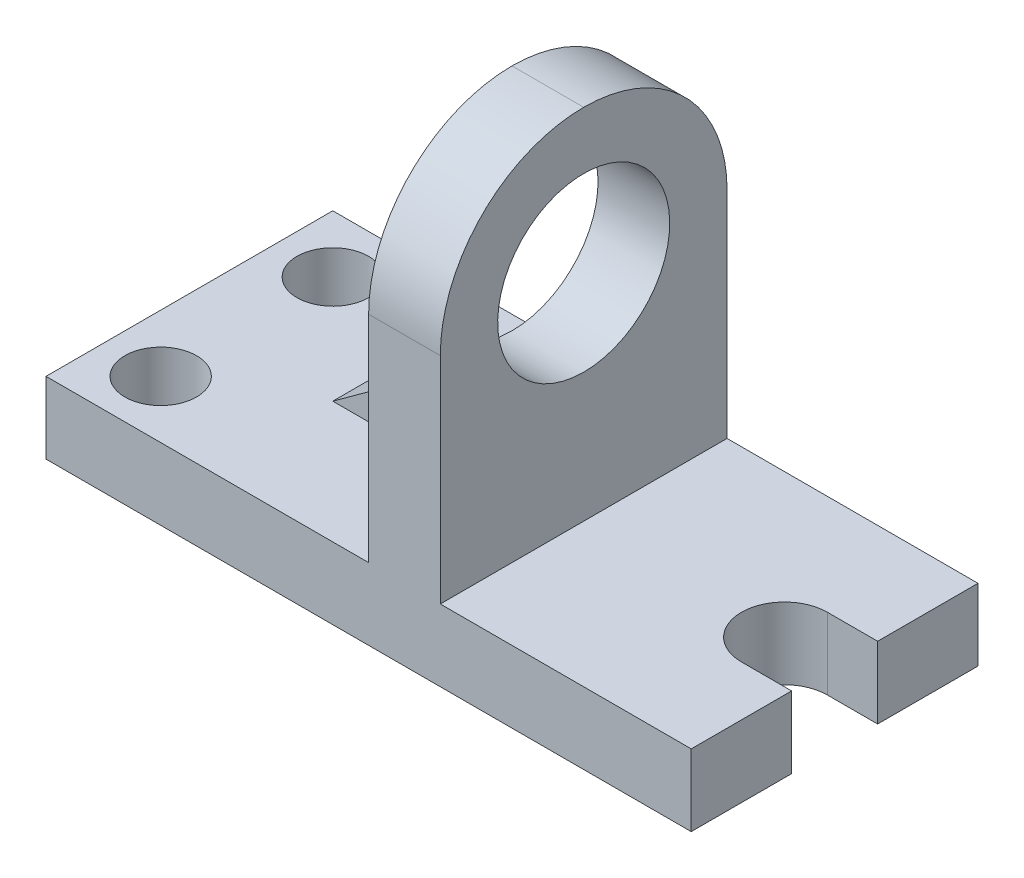
ISO-10303-21;
HEADER;
FILE_DESCRIPTION(('STEP AP214'),'2;1');
FILE_NAME('part.step','',(''),(''),'','','');
FILE_SCHEMA(('AUTOMOTIVE_DESIGN { 1 0 10303 214 1 1 1 1 }'));
ENDSEC;
DATA;
#1=APPLICATION_CONTEXT('core data for automotive mechanical design processes');
#2=APPLICATION_PROTOCOL_DEFINITION('international standard','automotive_design',2000,#1);
#3=PRODUCT_CONTEXT('',#1,'mechanical');
#4=PRODUCT('Part','Part','',(#3));
#5=PRODUCT_RELATED_PRODUCT_CATEGORY('part','',(#4));
#6=PRODUCT_DEFINITION_FORMATION('','',#4);
#7=PRODUCT_DEFINITION_CONTEXT('part definition',#1,'design');
#8=PRODUCT_DEFINITION('design','',#6,#7);
#9=PRODUCT_DEFINITION_SHAPE('','',#8);
#10=(LENGTH_UNIT() NAMED_UNIT(*) SI_UNIT(.MILLI.,.METRE.));
#11=(NAMED_UNIT(*) PLANE_ANGLE_UNIT() SI_UNIT($,.RADIAN.));
#12=(NAMED_UNIT(*) SI_UNIT($,.STERADIAN.) SOLID_ANGLE_UNIT());
#13=UNCERTAINTY_MEASURE_WITH_UNIT(LENGTH_MEASURE(1.E-05),#10,'distance_accuracy_value','');
#14=(GEOMETRIC_REPRESENTATION_CONTEXT(3) GLOBAL_UNCERTAINTY_ASSIGNED_CONTEXT((#13)) GLOBAL_UNIT_ASSIGNED_CONTEXT((#10,
#11,#12)) REPRESENTATION_CONTEXT('',''));
#15=CARTESIAN_POINT('',(0.,0.,0.));
#16=DIRECTION('',(0.,0.,1.));
#17=DIRECTION('',(1.,0.,0.));
#18=AXIS2_PLACEMENT_3D('',#15,#16,#17);
#19=CARTESIAN_POINT('',(0.,-2.5,-10.));
#20=DIRECTION('',(0.,-1.,0.));
#21=DIRECTION('',(0.,0.,-1.));
#22=AXIS2_PLACEMENT_3D('',#19,#20,#21);
#23=PLANE('',#22);
#24=DIRECTION('',(0.,0.,1.));
#25=VECTOR('',#24,1.);
#26=CARTESIAN_POINT('',(20.,-2.5,-10.));
#27=LINE('',#26,#25);
#28=CARTESIAN_POINT('',(20.,-2.5,-10.));
#29=VERTEX_POINT('',#28);
#30=CARTESIAN_POINT('',(20.,-2.5,-3.));
#31=VERTEX_POINT('',#30);
#32=EDGE_CURVE('E265',#29,#31,#27,.T.);
#33=ORIENTED_EDGE('',*,*,#32,.T.);
#34=DIRECTION('',(1.,0.,0.));
#35=VECTOR('',#34,1.);
#36=CARTESIAN_POINT('',(0.,-2.5,-3.));
#37=LINE('',#36,#35);
#38=CARTESIAN_POINT('',(16.5,-2.5,-3.));
#39=VERTEX_POINT('',#38);
#40=EDGE_CURVE('E188',#39,#31,#37,.T.);
#41=ORIENTED_EDGE('',*,*,#40,.F.);
#42=CARTESIAN_POINT('',(16.5,-2.5,0.));
#43=DIRECTION('',(0.,1.,0.));
#44=DIRECTION('',(0.,0.,1.));
#45=AXIS2_PLACEMENT_3D('',#42,#43,#44);
#46=CIRCLE('',#45,3.);
#47=CARTESIAN_POINT('',(16.5,-2.5,3.));
#48=VERTEX_POINT('',#47);
#49=EDGE_CURVE('E190',#39,#48,#46,.T.);
#50=ORIENTED_EDGE('',*,*,#49,.T.);
#51=DIRECTION('',(-1.,0.,0.));
#52=VECTOR('',#51,1.);
#53=CARTESIAN_POINT('',(0.,-2.5,3.));
#54=LINE('',#53,#52);
#55=CARTESIAN_POINT('',(20.,-2.5,3.));
#56=VERTEX_POINT('',#55);
#57=EDGE_CURVE('E193',#56,#48,#54,.T.);
#58=ORIENTED_EDGE('',*,*,#57,.F.);
#59=CARTESIAN_POINT('',(20.,-2.5,10.));
#60=VERTEX_POINT('',#59);
#61=EDGE_CURVE('E267',#56,#60,#27,.T.);
#62=ORIENTED_EDGE('',*,*,#61,.T.);
#63=DIRECTION('',(1.,0.,0.));
#64=VECTOR('',#63,1.);
#65=CARTESIAN_POINT('',(0.,-2.5,10.));
#66=LINE('',#65,#64);
#67=CARTESIAN_POINT('',(-25.,-2.5,10.));
#68=VERTEX_POINT('',#67);
#69=EDGE_CURVE('E168',#68,#60,#66,.T.);
#70=ORIENTED_EDGE('',*,*,#69,.F.);
#71=DIRECTION('',(0.,0.,1.));
#72=VECTOR('',#71,1.);
#73=CARTESIAN_POINT('',(-25.,-2.5,-10.));
#74=LINE('',#73,#72);
#75=CARTESIAN_POINT('',(-25.,-2.5,-10.));
#76=VERTEX_POINT('',#75);
#77=EDGE_CURVE('E165',#76,#68,#74,.T.);
#78=ORIENTED_EDGE('',*,*,#77,.F.);
#79=DIRECTION('',(1.,0.,0.));
#80=VECTOR('',#79,1.);
#81=CARTESIAN_POINT('',(0.,-2.5,-10.));
#82=LINE('',#81,#80);
#83=EDGE_CURVE('E152',#76,#29,#82,.T.);
#84=ORIENTED_EDGE('',*,*,#83,.T.);
#85=EDGE_LOOP('',(#33,#41,#50,#58,#62,#70,#78,#84));
#86=FACE_BOUND('',#85,.T.);
#87=CARTESIAN_POINT('',(-21.,-2.5,6.));
#88=DIRECTION('',(0.,1.,0.));
#89=DIRECTION('',(0.,0.,1.));
#90=AXIS2_PLACEMENT_3D('',#87,#88,#89);
#91=CIRCLE('',#90,2.5);
#92=CARTESIAN_POINT('',(-21.,-2.5,8.5));
#93=VERTEX_POINT('',#92);
#94=EDGE_CURVE('E178',#93,#93,#91,.T.);
#95=ORIENTED_EDGE('',*,*,#94,.T.);
#96=EDGE_LOOP('',(#95));
#97=FACE_BOUND('',#96,.T.);
#98=CARTESIAN_POINT('',(-21.,-2.5,-6.));
#99=DIRECTION('',(0.,-1.,0.));
#100=DIRECTION('',(0.,0.,-1.));
#101=AXIS2_PLACEMENT_3D('',#98,#99,#100);
#102=CIRCLE('',#101,2.5);
#103=CARTESIAN_POINT('',(-21.,-2.5,-8.5));
#104=VERTEX_POINT('',#103);
#105=EDGE_CURVE('E395',#104,#104,#102,.T.);
#106=ORIENTED_EDGE('',*,*,#105,.F.);
#107=EDGE_LOOP('',(#106));
#108=FACE_BOUND('',#107,.T.);
#109=ADVANCED_FACE('F37',(#86,#97,#108),#23,.T.);
#110=CARTESIAN_POINT('',(0.,2.5,-10.));
#111=DIRECTION('',(0.,-1.,0.));
#112=DIRECTION('',(0.,0.,-1.));
#113=AXIS2_PLACEMENT_3D('',#110,#111,#112);
#114=PLANE('',#113);
#115=DIRECTION('',(1.,0.,0.));
#116=VECTOR('',#115,1.);
#117=CARTESIAN_POINT('',(0.,2.5,-1.5));
#118=LINE('',#117,#116);
#119=CARTESIAN_POINT('',(-13.5,2.5,-1.5));
#120=VERTEX_POINT('',#119);
#121=CARTESIAN_POINT('',(-2.5,2.5,-1.5));
#122=VERTEX_POINT('',#121);
#123=EDGE_CURVE('E227',#120,#122,#118,.T.);
#124=ORIENTED_EDGE('',*,*,#123,.T.);
#125=DIRECTION('',(0.,0.,1.));
#126=VECTOR('',#125,1.);
#127=CARTESIAN_POINT('',(-2.5,2.5,-10.));
#128=LINE('',#127,#126);
#129=CARTESIAN_POINT('',(-2.5,2.5,-10.));
#130=VERTEX_POINT('',#129);
#131=EDGE_CURVE('E253',#130,#122,#128,.T.);
#132=ORIENTED_EDGE('',*,*,#131,.F.);
#133=DIRECTION('',(1.,0.,0.));
#134=VECTOR('',#133,1.);
#135=CARTESIAN_POINT('',(0.,2.5,-10.));
#136=LINE('',#135,#134);
#137=CARTESIAN_POINT('',(-25.,2.5,-10.));
#138=VERTEX_POINT('',#137);
#139=EDGE_CURVE('E249',#138,#130,#136,.T.);
#140=ORIENTED_EDGE('',*,*,#139,.F.);
#141=DIRECTION('',(0.,0.,-1.));
#142=VECTOR('',#141,1.);
#143=CARTESIAN_POINT('',(-25.,2.5,10.));
#144=LINE('',#143,#142);
#145=CARTESIAN_POINT('',(-25.,2.5,10.));
#146=VERTEX_POINT('',#145);
#147=EDGE_CURVE('E177',#146,#138,#144,.T.);
#148=ORIENTED_EDGE('',*,*,#147,.F.);
#149=DIRECTION('',(1.,0.,0.));
#150=VECTOR('',#149,1.);
#151=CARTESIAN_POINT('',(0.,2.5,10.));
#152=LINE('',#151,#150);
#153=CARTESIAN_POINT('',(-2.5,2.5,10.));
#154=VERTEX_POINT('',#153);
#155=EDGE_CURVE('E162',#146,#154,#152,.T.);
#156=ORIENTED_EDGE('',*,*,#155,.T.);
#157=CARTESIAN_POINT('',(-2.5,2.5,1.5));
#158=VERTEX_POINT('',#157);
#159=EDGE_CURVE('E257',#158,#154,#128,.T.);
#160=ORIENTED_EDGE('',*,*,#159,.F.);
#161=DIRECTION('',(1.,0.,0.));
#162=VECTOR('',#161,1.);
#163=CARTESIAN_POINT('',(0.,2.5,1.5));
#164=LINE('',#163,#162);
#165=CARTESIAN_POINT('',(-13.5,2.5,1.5));
#166=VERTEX_POINT('',#165);
#167=EDGE_CURVE('E218',#166,#158,#164,.T.);
#168=ORIENTED_EDGE('',*,*,#167,.F.);
#169=DIRECTION('',(0.,0.,1.));
#170=VECTOR('',#169,1.);
#171=CARTESIAN_POINT('',(-13.5,2.5,-1.5));
#172=LINE('',#171,#170);
#173=EDGE_CURVE('E230',#120,#166,#172,.T.);
#174=ORIENTED_EDGE('',*,*,#173,.F.);
#175=EDGE_LOOP('',(#124,#132,#140,#148,#156,#160,#168,#174));
#176=FACE_BOUND('',#175,.T.);
#177=CARTESIAN_POINT('',(-21.,2.5,6.));
#178=DIRECTION('',(0.,1.,0.));
#179=DIRECTION('',(0.,0.,1.));
#180=AXIS2_PLACEMENT_3D('',#177,#178,#179);
#181=CIRCLE('',#180,2.5);
#182=CARTESIAN_POINT('',(-21.,2.5,8.5));
#183=VERTEX_POINT('',#182);
#184=EDGE_CURVE('E181',#183,#183,#181,.T.);
#185=ORIENTED_EDGE('',*,*,#184,.F.);
#186=EDGE_LOOP('',(#185));
#187=FACE_BOUND('',#186,.T.);
#188=CARTESIAN_POINT('',(-21.,2.5,-6.));
#189=DIRECTION('',(0.,-1.,0.));
#190=DIRECTION('',(0.,0.,-1.));
#191=AXIS2_PLACEMENT_3D('',#188,#189,#190);
#192=CIRCLE('',#191,2.5);
#193=CARTESIAN_POINT('',(-21.,2.5,-8.5));
#194=VERTEX_POINT('',#193);
#195=EDGE_CURVE('E398',#194,#194,#192,.T.);
#196=ORIENTED_EDGE('',*,*,#195,.T.);
#197=EDGE_LOOP('',(#196));
#198=FACE_BOUND('',#197,.T.);
#199=ADVANCED_FACE('F300',(#176,#187,#198),#114,.F.);
#200=DIRECTION('',(1.,0.,0.));
#201=VECTOR('',#200,1.);
#202=CARTESIAN_POINT('',(0.,2.5,-3.));
#203=LINE('',#202,#201);
#204=CARTESIAN_POINT('',(16.5,2.5,-3.));
#205=VERTEX_POINT('',#204);
#206=CARTESIAN_POINT('',(20.,2.5,-3.));
#207=VERTEX_POINT('',#206);
#208=EDGE_CURVE('E187',#205,#207,#203,.T.);
#209=ORIENTED_EDGE('',*,*,#208,.T.);
#210=DIRECTION('',(0.,0.,1.));
#211=VECTOR('',#210,1.);
#212=CARTESIAN_POINT('',(20.,2.5,-10.));
#213=LINE('',#212,#211);
#214=CARTESIAN_POINT('',(20.,2.5,-10.));
#215=VERTEX_POINT('',#214);
#216=EDGE_CURVE('E261',#215,#207,#213,.T.);
#217=ORIENTED_EDGE('',*,*,#216,.F.);
#218=CARTESIAN_POINT('',(2.5,2.5,-10.));
#219=VERTEX_POINT('',#218);
#220=EDGE_CURVE('E246',#219,#215,#136,.T.);
#221=ORIENTED_EDGE('',*,*,#220,.F.);
#222=DIRECTION('',(0.,0.,1.));
#223=VECTOR('',#222,1.);
#224=CARTESIAN_POINT('',(2.5,2.5,-10.));
#225=LINE('',#224,#223);
#226=CARTESIAN_POINT('',(2.5,2.5,10.));
#227=VERTEX_POINT('',#226);
#228=EDGE_CURVE('E258',#219,#227,#225,.T.);
#229=ORIENTED_EDGE('',*,*,#228,.T.);
#230=CARTESIAN_POINT('',(20.,2.5,10.));
#231=VERTEX_POINT('',#230);
#232=EDGE_CURVE('E238',#227,#231,#152,.T.);
#233=ORIENTED_EDGE('',*,*,#232,.T.);
#234=CARTESIAN_POINT('',(20.,2.5,3.));
#235=VERTEX_POINT('',#234);
#236=EDGE_CURVE('E264',#235,#231,#213,.T.);
#237=ORIENTED_EDGE('',*,*,#236,.F.);
#238=DIRECTION('',(-1.,0.,0.));
#239=VECTOR('',#238,1.);
#240=CARTESIAN_POINT('',(0.,2.5,3.));
#241=LINE('',#240,#239);
#242=CARTESIAN_POINT('',(16.5,2.5,3.));
#243=VERTEX_POINT('',#242);
#244=EDGE_CURVE('E54',#235,#243,#241,.T.);
#245=ORIENTED_EDGE('',*,*,#244,.T.);
#246=CARTESIAN_POINT('',(16.5,2.5,0.));
#247=DIRECTION('',(0.,1.,0.));
#248=DIRECTION('',(0.,0.,1.));
#249=AXIS2_PLACEMENT_3D('',#246,#247,#248);
#250=CIRCLE('',#249,3.);
#251=EDGE_CURVE('E198',#205,#243,#250,.T.);
#252=ORIENTED_EDGE('',*,*,#251,.F.);
#253=EDGE_LOOP('',(#209,#217,#221,#229,#233,#237,#245,#252));
#254=FACE_BOUND('',#253,.T.);
#255=ADVANCED_FACE('F305',(#254),#114,.F.);
#256=CARTESIAN_POINT('',(20.,0.,-10.));
#257=DIRECTION('',(1.,0.,0.));
#258=DIRECTION('',(0.,0.,-1.));
#259=AXIS2_PLACEMENT_3D('',#256,#257,#258);
#260=PLANE('',#259);
#261=ORIENTED_EDGE('',*,*,#216,.T.);
#262=DIRECTION('',(0.,1.,0.));
#263=VECTOR('',#262,1.);
#264=CARTESIAN_POINT('',(20.,-2.5,-3.));
#265=LINE('',#264,#263);
#266=EDGE_CURVE('E202',#31,#207,#265,.T.);
#267=ORIENTED_EDGE('',*,*,#266,.F.);
#268=ORIENTED_EDGE('',*,*,#32,.F.);
#269=DIRECTION('',(0.,1.,0.));
#270=VECTOR('',#269,1.);
#271=CARTESIAN_POINT('',(20.,0.,-10.));
#272=LINE('',#271,#270);
#273=EDGE_CURVE('E159',#29,#215,#272,.T.);
#274=ORIENTED_EDGE('',*,*,#273,.T.);
#275=EDGE_LOOP('',(#261,#267,#268,#274));
#276=FACE_BOUND('',#275,.T.);
#277=ADVANCED_FACE('F309',(#276),#260,.T.);
#278=ORIENTED_EDGE('',*,*,#61,.F.);
#279=DIRECTION('',(0.,1.,0.));
#280=VECTOR('',#279,1.);
#281=CARTESIAN_POINT('',(20.,-2.5,3.));
#282=LINE('',#281,#280);
#283=EDGE_CURVE('E205',#56,#235,#282,.T.);
#284=ORIENTED_EDGE('',*,*,#283,.T.);
#285=ORIENTED_EDGE('',*,*,#236,.T.);
#286=DIRECTION('',(0.,1.,0.));
#287=VECTOR('',#286,1.);
#288=CARTESIAN_POINT('',(20.,0.,10.));
#289=LINE('',#288,#287);
#290=EDGE_CURVE('E235',#60,#231,#289,.T.);
#291=ORIENTED_EDGE('',*,*,#290,.F.);
#292=EDGE_LOOP('',(#278,#284,#285,#291));
#293=FACE_BOUND('',#292,.T.);
#294=ADVANCED_FACE('F312',(#293),#260,.T.);
#295=CARTESIAN_POINT('',(-2.5,0.,-10.));
#296=DIRECTION('',(-1.,0.,0.));
#297=DIRECTION('',(0.,-1.,0.));
#298=AXIS2_PLACEMENT_3D('',#295,#296,#297);
#299=PLANE('',#298);
#300=CARTESIAN_POINT('',(-2.5,17.5,0.));
#301=DIRECTION('',(-1.,0.,0.));
#302=DIRECTION('',(0.,-1.,0.));
#303=AXIS2_PLACEMENT_3D('',#300,#301,#302);
#304=CIRCLE('',#303,6.);
#305=CARTESIAN_POINT('',(-2.5,11.5,0.));
#306=VERTEX_POINT('',#305);
#307=EDGE_CURVE('E204',#306,#306,#304,.T.);
#308=ORIENTED_EDGE('',*,*,#307,.F.);
#309=EDGE_LOOP('',(#308));
#310=FACE_BOUND('',#309,.T.);
#311=DIRECTION('',(0.,-1.,0.));
#312=VECTOR('',#311,1.);
#313=CARTESIAN_POINT('',(-2.5,0.,10.));
#314=LINE('',#313,#312);
#315=CARTESIAN_POINT('',(-2.5,17.5,10.));
#316=VERTEX_POINT('',#315);
#317=EDGE_CURVE('E243',#316,#154,#314,.T.);
#318=ORIENTED_EDGE('',*,*,#317,.F.);
#319=CARTESIAN_POINT('',(-2.5,17.5,0.));
#320=DIRECTION('',(-1.,0.,0.));
#321=DIRECTION('',(0.,-1.,0.));
#322=AXIS2_PLACEMENT_3D('',#319,#320,#321);
#323=CIRCLE('',#322,10.);
#324=CARTESIAN_POINT('',(-2.5,27.5,0.));
#325=VERTEX_POINT('',#324);
#326=EDGE_CURVE('E46',#316,#325,#323,.T.);
#327=ORIENTED_EDGE('',*,*,#326,.T.);
#328=CARTESIAN_POINT('',(-2.5,17.5,0.));
#329=DIRECTION('',(-1.,0.,0.));
#330=DIRECTION('',(0.,-1.,0.));
#331=AXIS2_PLACEMENT_3D('',#328,#329,#330);
#332=CIRCLE('',#331,10.);
#333=CARTESIAN_POINT('',(-2.5,17.5,-10.));
#334=VERTEX_POINT('',#333);
#335=EDGE_CURVE('E62',#325,#334,#332,.T.);
#336=ORIENTED_EDGE('',*,*,#335,.T.);
#337=DIRECTION('',(0.,-1.,0.));
#338=VECTOR('',#337,1.);
#339=CARTESIAN_POINT('',(-2.5,0.,-10.));
#340=LINE('',#339,#338);
#341=EDGE_CURVE('E251',#334,#130,#340,.T.);
#342=ORIENTED_EDGE('',*,*,#341,.T.);
#343=ORIENTED_EDGE('',*,*,#131,.T.);
#344=DIRECTION('',(0.,-1.,0.));
#345=VECTOR('',#344,1.);
#346=CARTESIAN_POINT('',(-2.5,0.,-1.5));
#347=LINE('',#346,#345);
#348=CARTESIAN_POINT('',(-2.5,10.5,-1.5));
#349=VERTEX_POINT('',#348);
#350=EDGE_CURVE('E221',#349,#122,#347,.T.);
#351=ORIENTED_EDGE('',*,*,#350,.F.);
#352=DIRECTION('',(0.,0.,1.));
#353=VECTOR('',#352,1.);
#354=CARTESIAN_POINT('',(-2.5,10.5,-1.5));
#355=LINE('',#354,#353);
#356=CARTESIAN_POINT('',(-2.5,10.5,1.5));
#357=VERTEX_POINT('',#356);
#358=EDGE_CURVE('E229',#349,#357,#355,.T.);
#359=ORIENTED_EDGE('',*,*,#358,.T.);
#360=DIRECTION('',(0.,-1.,0.));
#361=VECTOR('',#360,1.);
#362=CARTESIAN_POINT('',(-2.5,0.,1.5));
#363=LINE('',#362,#361);
#364=EDGE_CURVE('E212',#357,#158,#363,.T.);
#365=ORIENTED_EDGE('',*,*,#364,.T.);
#366=ORIENTED_EDGE('',*,*,#159,.T.);
#367=EDGE_LOOP('',(#318,#327,#336,#342,#343,#351,#359,#365,#366));
#368=FACE_BOUND('',#367,.T.);
#369=ADVANCED_FACE('F316',(#310,#368),#299,.T.);
#370=CARTESIAN_POINT('',(2.5,0.,-10.));
#371=DIRECTION('',(-1.,0.,0.));
#372=DIRECTION('',(0.,-1.,0.));
#373=AXIS2_PLACEMENT_3D('',#370,#371,#372);
#374=PLANE('',#373);
#375=CARTESIAN_POINT('',(2.5,17.5,0.));
#376=DIRECTION('',(-1.,0.,0.));
#377=DIRECTION('',(0.,-1.,0.));
#378=AXIS2_PLACEMENT_3D('',#375,#376,#377);
#379=CIRCLE('',#378,6.);
#380=CARTESIAN_POINT('',(2.5,11.5,0.));
#381=VERTEX_POINT('',#380);
#382=EDGE_CURVE('E41',#381,#381,#379,.T.);
#383=ORIENTED_EDGE('',*,*,#382,.T.);
#384=EDGE_LOOP('',(#383));
#385=FACE_BOUND('',#384,.T.);
#386=CARTESIAN_POINT('',(2.5,17.5,0.));
#387=DIRECTION('',(-1.,0.,0.));
#388=DIRECTION('',(0.,-1.,0.));
#389=AXIS2_PLACEMENT_3D('',#386,#387,#388);
#390=CIRCLE('',#389,10.);
#391=CARTESIAN_POINT('',(2.5,17.5,-10.));
#392=VERTEX_POINT('',#391);
#393=CARTESIAN_POINT('',(2.5,27.5,0.));
#394=VERTEX_POINT('',#393);
#395=EDGE_CURVE('E256',#392,#394,#390,.F.);
#396=ORIENTED_EDGE('',*,*,#395,.T.);
#397=CARTESIAN_POINT('',(2.5,17.5,0.));
#398=DIRECTION('',(-1.,0.,0.));
#399=DIRECTION('',(0.,-1.,0.));
#400=AXIS2_PLACEMENT_3D('',#397,#398,#399);
#401=CIRCLE('',#400,10.);
#402=CARTESIAN_POINT('',(2.5,17.5,10.));
#403=VERTEX_POINT('',#402);
#404=EDGE_CURVE('E269',#394,#403,#401,.F.);
#405=ORIENTED_EDGE('',*,*,#404,.T.);
#406=DIRECTION('',(0.,-1.,0.));
#407=VECTOR('',#406,1.);
#408=CARTESIAN_POINT('',(2.5,0.,10.));
#409=LINE('',#408,#407);
#410=EDGE_CURVE('E241',#403,#227,#409,.T.);
#411=ORIENTED_EDGE('',*,*,#410,.T.);
#412=ORIENTED_EDGE('',*,*,#228,.F.);
#413=DIRECTION('',(0.,-1.,0.));
#414=VECTOR('',#413,1.);
#415=CARTESIAN_POINT('',(2.5,0.,-10.));
#416=LINE('',#415,#414);
#417=EDGE_CURVE('E248',#392,#219,#416,.T.);
#418=ORIENTED_EDGE('',*,*,#417,.F.);
#419=EDGE_LOOP('',(#396,#405,#411,#412,#418));
#420=FACE_BOUND('',#419,.T.);
#421=ADVANCED_FACE('F282',(#385,#420),#374,.F.);
#422=CARTESIAN_POINT('',(0.,0.,-10.));
#423=DIRECTION('',(0.,0.,1.));
#424=DIRECTION('',(1.,0.,0.));
#425=AXIS2_PLACEMENT_3D('',#422,#423,#424);
#426=PLANE('',#425);
#427=ORIENTED_EDGE('',*,*,#341,.F.);
#428=DIRECTION('',(1.,0.,0.));
#429=VECTOR('',#428,1.);
#430=CARTESIAN_POINT('',(0.,17.5,-10.));
#431=LINE('',#430,#429);
#432=EDGE_CURVE('E11',#334,#392,#431,.T.);
#433=ORIENTED_EDGE('',*,*,#432,.T.);
#434=ORIENTED_EDGE('',*,*,#417,.T.);
#435=ORIENTED_EDGE('',*,*,#220,.T.);
#436=ORIENTED_EDGE('',*,*,#273,.F.);
#437=ORIENTED_EDGE('',*,*,#83,.F.);
#438=DIRECTION('',(0.,-1.,0.));
#439=VECTOR('',#438,1.);
#440=CARTESIAN_POINT('',(-25.,2.5,-10.));
#441=LINE('',#440,#439);
#442=EDGE_CURVE('E157',#138,#76,#441,.T.);
#443=ORIENTED_EDGE('',*,*,#442,.F.);
#444=ORIENTED_EDGE('',*,*,#139,.T.);
#445=EDGE_LOOP('',(#427,#433,#434,#435,#436,#437,#443,#444));
#446=FACE_BOUND('',#445,.T.);
#447=ADVANCED_FACE('F154',(#446),#426,.F.);
#448=CARTESIAN_POINT('',(0.,0.,10.));
#449=DIRECTION('',(0.,0.,1.));
#450=DIRECTION('',(1.,0.,0.));
#451=AXIS2_PLACEMENT_3D('',#448,#449,#450);
#452=PLANE('',#451);
#453=ORIENTED_EDGE('',*,*,#410,.F.);
#454=DIRECTION('',(1.,0.,0.));
#455=VECTOR('',#454,1.);
#456=CARTESIAN_POINT('',(-2.5,17.5,10.));
#457=LINE('',#456,#455);
#458=EDGE_CURVE('E271',#403,#316,#457,.F.);
#459=ORIENTED_EDGE('',*,*,#458,.T.);
#460=ORIENTED_EDGE('',*,*,#317,.T.);
#461=ORIENTED_EDGE('',*,*,#155,.F.);
#462=DIRECTION('',(0.,1.,0.));
#463=VECTOR('',#462,1.);
#464=CARTESIAN_POINT('',(-25.,-2.5,10.));
#465=LINE('',#464,#463);
#466=EDGE_CURVE('E172',#68,#146,#465,.T.);
#467=ORIENTED_EDGE('',*,*,#466,.F.);
#468=ORIENTED_EDGE('',*,*,#69,.T.);
#469=ORIENTED_EDGE('',*,*,#290,.T.);
#470=ORIENTED_EDGE('',*,*,#232,.F.);
#471=EDGE_LOOP('',(#453,#459,#460,#461,#467,#468,#469,#470));
#472=FACE_BOUND('',#471,.T.);
#473=ADVANCED_FACE('F322',(#472),#452,.T.);
#474=CARTESIAN_POINT('',(-5.85945945945946,8.05675675675676,-1.5));
#475=DIRECTION('',(0.588171697675046,-0.808736084303189,0.));
#476=DIRECTION('',(0.808736084303188,0.588171697675046,0.));
#477=AXIS2_PLACEMENT_3D('',#474,#475,#476);
#478=PLANE('',#477);
#479=ORIENTED_EDGE('',*,*,#173,.T.);
#480=DIRECTION('',(0.808736084303188,0.588171697675046,0.));
#481=VECTOR('',#480,1.);
#482=CARTESIAN_POINT('',(-5.85945945945946,8.05675675675676,1.5));
#483=LINE('',#482,#481);
#484=EDGE_CURVE('E214',#166,#357,#483,.T.);
#485=ORIENTED_EDGE('',*,*,#484,.T.);
#486=ORIENTED_EDGE('',*,*,#358,.F.);
#487=DIRECTION('',(0.808736084303188,0.588171697675046,0.));
#488=VECTOR('',#487,1.);
#489=CARTESIAN_POINT('',(-5.85945945945946,8.05675675675676,-1.5));
#490=LINE('',#489,#488);
#491=EDGE_CURVE('E224',#120,#349,#490,.T.);
#492=ORIENTED_EDGE('',*,*,#491,.F.);
#493=EDGE_LOOP('',(#479,#485,#486,#492));
#494=FACE_BOUND('',#493,.T.);
#495=ADVANCED_FACE('F325',(#494),#478,.F.);
#496=CARTESIAN_POINT('',(0.,0.,-1.5));
#497=DIRECTION('',(0.,0.,1.));
#498=DIRECTION('',(1.,0.,0.));
#499=AXIS2_PLACEMENT_3D('',#496,#497,#498);
#500=PLANE('',#499);
#501=ORIENTED_EDGE('',*,*,#350,.T.);
#502=ORIENTED_EDGE('',*,*,#123,.F.);
#503=ORIENTED_EDGE('',*,*,#491,.T.);
#504=EDGE_LOOP('',(#501,#502,#503));
#505=FACE_BOUND('',#504,.T.);
#506=ADVANCED_FACE('F329',(#505),#500,.F.);
#507=CARTESIAN_POINT('',(0.,0.,1.5));
#508=DIRECTION('',(0.,0.,1.));
#509=DIRECTION('',(1.,0.,0.));
#510=AXIS2_PLACEMENT_3D('',#507,#508,#509);
#511=PLANE('',#510);
#512=ORIENTED_EDGE('',*,*,#364,.F.);
#513=ORIENTED_EDGE('',*,*,#484,.F.);
#514=ORIENTED_EDGE('',*,*,#167,.T.);
#515=EDGE_LOOP('',(#512,#513,#514));
#516=FACE_BOUND('',#515,.T.);
#517=ADVANCED_FACE('F332',(#516),#511,.T.);
#518=CARTESIAN_POINT('',(0.,17.5,0.));
#519=DIRECTION('',(1.,0.,0.));
#520=DIRECTION('',(0.,0.,-1.));
#521=AXIS2_PLACEMENT_3D('',#518,#519,#520);
#522=CYLINDRICAL_SURFACE('',#521,10.);
#523=ORIENTED_EDGE('',*,*,#432,.F.);
#524=ORIENTED_EDGE('',*,*,#335,.F.);
#525=DIRECTION('',(1.,0.,0.));
#526=VECTOR('',#525,1.);
#527=CARTESIAN_POINT('',(0.,27.5,0.));
#528=LINE('',#527,#526);
#529=EDGE_CURVE('E215',#394,#325,#528,.F.);
#530=ORIENTED_EDGE('',*,*,#529,.F.);
#531=ORIENTED_EDGE('',*,*,#395,.F.);
#532=EDGE_LOOP('',(#523,#524,#530,#531));
#533=FACE_BOUND('',#532,.T.);
#534=ADVANCED_FACE('F39',(#533),#522,.T.);
#535=CARTESIAN_POINT('',(0.,17.5,0.));
#536=DIRECTION('',(-1.,0.,0.));
#537=DIRECTION('',(0.,0.,1.));
#538=AXIS2_PLACEMENT_3D('',#535,#536,#537);
#539=CYLINDRICAL_SURFACE('',#538,10.);
#540=ORIENTED_EDGE('',*,*,#326,.F.);
#541=ORIENTED_EDGE('',*,*,#458,.F.);
#542=ORIENTED_EDGE('',*,*,#404,.F.);
#543=ORIENTED_EDGE('',*,*,#529,.T.);
#544=EDGE_LOOP('',(#540,#541,#542,#543));
#545=FACE_BOUND('',#544,.T.);
#546=ADVANCED_FACE('F288',(#545),#539,.T.);
#547=CARTESIAN_POINT('',(20.,17.5,0.));
#548=DIRECTION('',(-1.,0.,0.));
#549=DIRECTION('',(0.,-1.,0.));
#550=AXIS2_PLACEMENT_3D('',#547,#548,#549);
#551=CYLINDRICAL_SURFACE('',#550,6.);
#552=ORIENTED_EDGE('',*,*,#307,.T.);
#553=EDGE_LOOP('',(#552));
#554=FACE_BOUND('',#553,.T.);
#555=ORIENTED_EDGE('',*,*,#382,.F.);
#556=EDGE_LOOP('',(#555));
#557=FACE_BOUND('',#556,.T.);
#558=ADVANCED_FACE('F285',(#554,#557),#551,.F.);
#559=CARTESIAN_POINT('',(0.,-2.5,-3.));
#560=DIRECTION('',(0.,0.,1.));
#561=DIRECTION('',(1.,0.,0.));
#562=AXIS2_PLACEMENT_3D('',#559,#560,#561);
#563=PLANE('',#562);
#564=ORIENTED_EDGE('',*,*,#208,.F.);
#565=DIRECTION('',(0.,1.,0.));
#566=VECTOR('',#565,1.);
#567=CARTESIAN_POINT('',(16.5,-2.5,-3.));
#568=LINE('',#567,#566);
#569=EDGE_CURVE('E195',#39,#205,#568,.T.);
#570=ORIENTED_EDGE('',*,*,#569,.F.);
#571=ORIENTED_EDGE('',*,*,#40,.T.);
#572=ORIENTED_EDGE('',*,*,#266,.T.);
#573=EDGE_LOOP('',(#564,#570,#571,#572));
#574=FACE_BOUND('',#573,.T.);
#575=ADVANCED_FACE('F287',(#574),#563,.T.);
#576=CARTESIAN_POINT('',(0.,-2.5,3.));
#577=DIRECTION('',(0.,0.,-1.));
#578=DIRECTION('',(-1.,0.,0.));
#579=AXIS2_PLACEMENT_3D('',#576,#577,#578);
#580=PLANE('',#579);
#581=ORIENTED_EDGE('',*,*,#244,.F.);
#582=ORIENTED_EDGE('',*,*,#283,.F.);
#583=ORIENTED_EDGE('',*,*,#57,.T.);
#584=DIRECTION('',(0.,1.,0.));
#585=VECTOR('',#584,1.);
#586=CARTESIAN_POINT('',(16.5,-2.5,3.));
#587=LINE('',#586,#585);
#588=EDGE_CURVE('E207',#48,#243,#587,.T.);
#589=ORIENTED_EDGE('',*,*,#588,.T.);
#590=EDGE_LOOP('',(#581,#582,#583,#589));
#591=FACE_BOUND('',#590,.T.);
#592=ADVANCED_FACE('F295',(#591),#580,.T.);
#593=CARTESIAN_POINT('',(16.5,-2.5,0.));
#594=DIRECTION('',(0.,1.,0.));
#595=DIRECTION('',(0.,0.,1.));
#596=AXIS2_PLACEMENT_3D('',#593,#594,#595);
#597=CYLINDRICAL_SURFACE('',#596,3.);
#598=ORIENTED_EDGE('',*,*,#251,.T.);
#599=ORIENTED_EDGE('',*,*,#588,.F.);
#600=ORIENTED_EDGE('',*,*,#49,.F.);
#601=ORIENTED_EDGE('',*,*,#569,.T.);
#602=EDGE_LOOP('',(#598,#599,#600,#601));
#603=FACE_BOUND('',#602,.T.);
#604=ADVANCED_FACE('F373',(#603),#597,.F.);
#605=CARTESIAN_POINT('',(-25.,0.,0.));
#606=DIRECTION('',(-1.,0.,0.));
#607=DIRECTION('',(0.,0.,1.));
#608=AXIS2_PLACEMENT_3D('',#605,#606,#607);
#609=PLANE('',#608);
#610=ORIENTED_EDGE('',*,*,#442,.T.);
#611=ORIENTED_EDGE('',*,*,#77,.T.);
#612=ORIENTED_EDGE('',*,*,#466,.T.);
#613=ORIENTED_EDGE('',*,*,#147,.T.);
#614=EDGE_LOOP('',(#610,#611,#612,#613));
#615=FACE_BOUND('',#614,.T.);
#616=ADVANCED_FACE('F175',(#615),#609,.T.);
#617=CARTESIAN_POINT('',(-21.,-2.5,6.));
#618=DIRECTION('',(0.,1.,0.));
#619=DIRECTION('',(0.,0.,1.));
#620=AXIS2_PLACEMENT_3D('',#617,#618,#619);
#621=CYLINDRICAL_SURFACE('',#620,2.5);
#622=ORIENTED_EDGE('',*,*,#94,.F.);
#623=EDGE_LOOP('',(#622));
#624=FACE_BOUND('',#623,.T.);
#625=ORIENTED_EDGE('',*,*,#184,.T.);
#626=EDGE_LOOP('',(#625));
#627=FACE_BOUND('',#626,.T.);
#628=ADVANCED_FACE('F383',(#624,#627),#621,.F.);
#629=CARTESIAN_POINT('',(-21.,-2.5,-6.));
#630=DIRECTION('',(0.,1.,0.));
#631=DIRECTION('',(0.,0.,1.));
#632=AXIS2_PLACEMENT_3D('',#629,#630,#631);
#633=CYLINDRICAL_SURFACE('',#632,2.5);
#634=ORIENTED_EDGE('',*,*,#105,.T.);
#635=EDGE_LOOP('',(#634));
#636=FACE_BOUND('',#635,.T.);
#637=ORIENTED_EDGE('',*,*,#195,.F.);
#638=EDGE_LOOP('',(#637));
#639=FACE_BOUND('',#638,.T.);
#640=ADVANCED_FACE('F386',(#636,#639),#633,.F.);
#641=CLOSED_SHELL('',(#109,#199,#255,#277,#294,#369,#421,#447,#473,#495,#506,#517,#534,#546,
#558,#575,#592,#604,#616,#628,#640));
#642=MANIFOLD_SOLID_BREP('B2',#641);
#643=ADVANCED_BREP_SHAPE_REPRESENTATION('',(#18,#642),#14);
#644=SHAPE_DEFINITION_REPRESENTATION(#9,#643);
ENDSEC;
END-ISO-10303-21;
